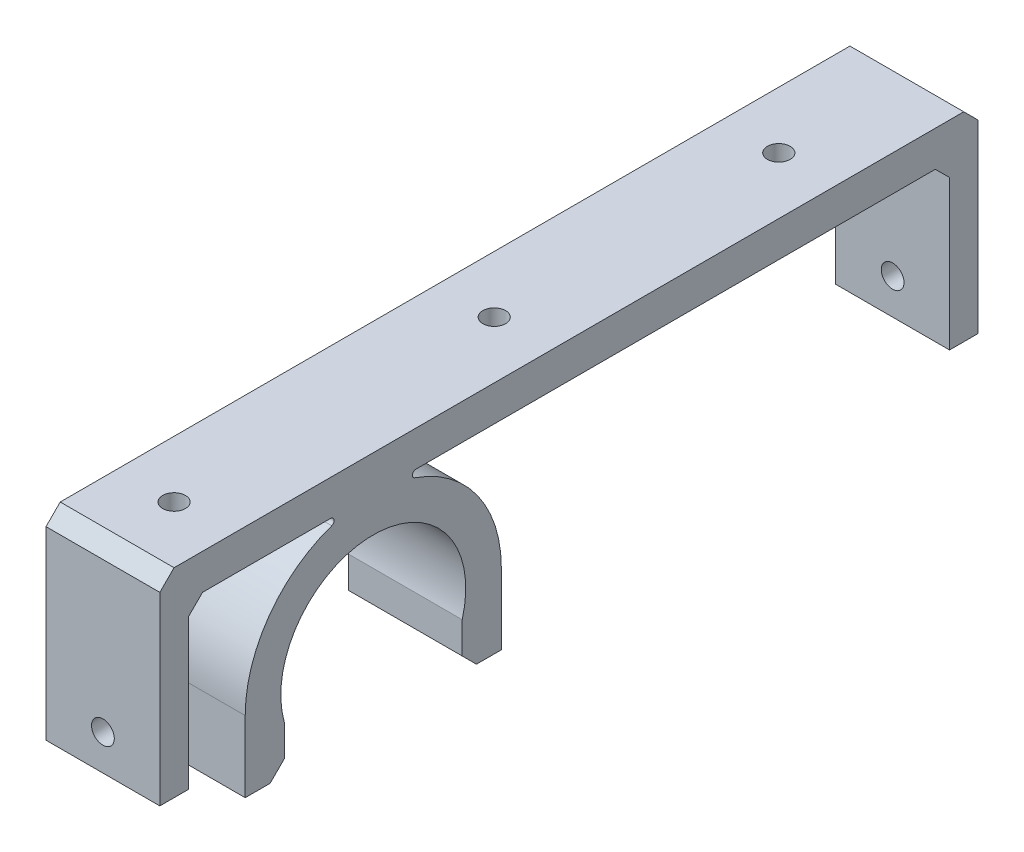
ISO-10303-21;
HEADER;
FILE_DESCRIPTION(('STEP AP214'),'2;1');
FILE_NAME('part.step','',(''),(''),'','','');
FILE_SCHEMA(('AUTOMOTIVE_DESIGN { 1 0 10303 214 1 1 1 1 }'));
ENDSEC;
DATA;
#1=APPLICATION_CONTEXT('core data for automotive mechanical design processes');
#2=APPLICATION_PROTOCOL_DEFINITION('international standard','automotive_design',2000,#1);
#3=PRODUCT_CONTEXT('',#1,'mechanical');
#4=PRODUCT('Part','Part','',(#3));
#5=PRODUCT_RELATED_PRODUCT_CATEGORY('part','',(#4));
#6=PRODUCT_DEFINITION_FORMATION('','',#4);
#7=PRODUCT_DEFINITION_CONTEXT('part definition',#1,'design');
#8=PRODUCT_DEFINITION('design','',#6,#7);
#9=PRODUCT_DEFINITION_SHAPE('','',#8);
#10=(LENGTH_UNIT() NAMED_UNIT(*) SI_UNIT(.MILLI.,.METRE.));
#11=(NAMED_UNIT(*) PLANE_ANGLE_UNIT() SI_UNIT($,.RADIAN.));
#12=(NAMED_UNIT(*) SI_UNIT($,.STERADIAN.) SOLID_ANGLE_UNIT());
#13=UNCERTAINTY_MEASURE_WITH_UNIT(LENGTH_MEASURE(1.E-05),#10,'distance_accuracy_value','');
#14=(GEOMETRIC_REPRESENTATION_CONTEXT(3) GLOBAL_UNCERTAINTY_ASSIGNED_CONTEXT((#13)) GLOBAL_UNIT_ASSIGNED_CONTEXT((#10,
#11,#12)) REPRESENTATION_CONTEXT('',''));
#15=CARTESIAN_POINT('',(0.,0.,0.));
#16=DIRECTION('',(0.,0.,1.));
#17=DIRECTION('',(1.,0.,0.));
#18=AXIS2_PLACEMENT_3D('',#15,#16,#17);
#19=CARTESIAN_POINT('',(8.,-10.,-12.5));
#20=DIRECTION('',(0.,1.,0.));
#21=DIRECTION('',(0.,0.,1.));
#22=AXIS2_PLACEMENT_3D('',#19,#20,#21);
#23=PLANE('',#22);
#24=DIRECTION('',(0.,0.,-1.));
#25=VECTOR('',#24,1.);
#26=CARTESIAN_POINT('',(8.,-10.,-12.5));
#27=LINE('',#26,#25);
#28=CARTESIAN_POINT('',(8.,-10.,-14.5));
#29=VERTEX_POINT('',#28);
#30=CARTESIAN_POINT('',(8.,-10.,-18.));
#31=VERTEX_POINT('',#30);
#32=EDGE_CURVE('E210',#29,#31,#27,.T.);
#33=ORIENTED_EDGE('',*,*,#32,.F.);
#34=DIRECTION('',(-1.,0.,0.));
#35=VECTOR('',#34,1.);
#36=CARTESIAN_POINT('',(8.,-10.,-14.5));
#37=LINE('',#36,#35);
#38=CARTESIAN_POINT('',(-8.,-10.,-14.5));
#39=VERTEX_POINT('',#38);
#40=EDGE_CURVE('E259',#29,#39,#37,.T.);
#41=ORIENTED_EDGE('',*,*,#40,.T.);
#42=DIRECTION('',(0.,0.,-1.));
#43=VECTOR('',#42,1.);
#44=CARTESIAN_POINT('',(-8.,-10.,-12.5));
#45=LINE('',#44,#43);
#46=CARTESIAN_POINT('',(-8.,-10.,-18.));
#47=VERTEX_POINT('',#46);
#48=EDGE_CURVE('E234',#39,#47,#45,.T.);
#49=ORIENTED_EDGE('',*,*,#48,.T.);
#50=DIRECTION('',(-1.,0.,0.));
#51=VECTOR('',#50,1.);
#52=CARTESIAN_POINT('',(8.,-10.,-18.));
#53=LINE('',#52,#51);
#54=EDGE_CURVE('E227',#31,#47,#53,.T.);
#55=ORIENTED_EDGE('',*,*,#54,.F.);
#56=EDGE_LOOP('',(#33,#41,#49,#55));
#57=FACE_BOUND('',#56,.T.);
#58=ADVANCED_FACE('F37',(#57),#23,.F.);
#59=CARTESIAN_POINT('',(8.,-10.,-18.));
#60=DIRECTION('',(0.,0.,1.));
#61=DIRECTION('',(0.,-1.,0.));
#62=AXIS2_PLACEMENT_3D('',#59,#60,#61);
#63=PLANE('',#62);
#64=DIRECTION('',(0.,1.,0.));
#65=VECTOR('',#64,1.);
#66=CARTESIAN_POINT('',(-8.,-10.,-18.));
#67=LINE('',#66,#65);
#68=CARTESIAN_POINT('',(-8.,0.,-18.));
#69=VERTEX_POINT('',#68);
#70=EDGE_CURVE('E392',#47,#69,#67,.T.);
#71=ORIENTED_EDGE('',*,*,#70,.T.);
#72=DIRECTION('',(-1.,0.,0.));
#73=VECTOR('',#72,1.);
#74=CARTESIAN_POINT('',(8.,0.,-18.));
#75=LINE('',#74,#73);
#76=CARTESIAN_POINT('',(8.,0.,-18.));
#77=VERTEX_POINT('',#76);
#78=EDGE_CURVE('E229',#77,#69,#75,.T.);
#79=ORIENTED_EDGE('',*,*,#78,.F.);
#80=DIRECTION('',(0.,1.,0.));
#81=VECTOR('',#80,1.);
#82=CARTESIAN_POINT('',(8.,-10.,-18.));
#83=LINE('',#82,#81);
#84=EDGE_CURVE('E214',#31,#77,#83,.T.);
#85=ORIENTED_EDGE('',*,*,#84,.F.);
#86=ORIENTED_EDGE('',*,*,#54,.T.);
#87=EDGE_LOOP('',(#71,#79,#85,#86));
#88=FACE_BOUND('',#87,.T.);
#89=ADVANCED_FACE('F226',(#88),#63,.F.);
#90=CARTESIAN_POINT('',(8.,0.,0.));
#91=DIRECTION('',(-1.,0.,0.));
#92=DIRECTION('',(0.,0.,1.));
#93=AXIS2_PLACEMENT_3D('',#90,#91,#92);
#94=CYLINDRICAL_SURFACE('',#93,18.);
#95=CARTESIAN_POINT('',(-8.,0.,0.));
#96=DIRECTION('',(1.,0.,0.));
#97=DIRECTION('',(0.,0.,-1.));
#98=AXIS2_PLACEMENT_3D('',#95,#96,#97);
#99=CIRCLE('',#98,18.);
#100=CARTESIAN_POINT('',(-8.,17.027027027027,-5.83783783783784));
#101=VERTEX_POINT('',#100);
#102=EDGE_CURVE('E386',#69,#101,#99,.T.);
#103=ORIENTED_EDGE('',*,*,#102,.T.);
#104=DIRECTION('',(-1.,0.,0.));
#105=VECTOR('',#104,1.);
#106=CARTESIAN_POINT('',(8.,17.027027027027,-5.83783783783784));
#107=LINE('',#106,#105);
#108=CARTESIAN_POINT('',(8.,17.027027027027,-5.83783783783784));
#109=VERTEX_POINT('',#108);
#110=EDGE_CURVE('E241',#109,#101,#107,.T.);
#111=ORIENTED_EDGE('',*,*,#110,.F.);
#112=CARTESIAN_POINT('',(8.,0.,0.));
#113=DIRECTION('',(1.,0.,0.));
#114=DIRECTION('',(0.,0.,-1.));
#115=AXIS2_PLACEMENT_3D('',#112,#113,#114);
#116=CIRCLE('',#115,18.);
#117=EDGE_CURVE('E231',#77,#109,#116,.T.);
#118=ORIENTED_EDGE('',*,*,#117,.F.);
#119=ORIENTED_EDGE('',*,*,#78,.T.);
#120=EDGE_LOOP('',(#103,#111,#118,#119));
#121=FACE_BOUND('',#120,.T.);
#122=ADVANCED_FACE('F446',(#121),#94,.T.);
#123=CARTESIAN_POINT('',(8.,17.5,-6.));
#124=DIRECTION('',(-1.,0.,0.));
#125=DIRECTION('',(0.,0.,1.));
#126=AXIS2_PLACEMENT_3D('',#123,#124,#125);
#127=CYLINDRICAL_SURFACE('',#126,0.5);
#128=CARTESIAN_POINT('',(-8.,17.5,-6.));
#129=DIRECTION('',(-1.,0.,0.));
#130=DIRECTION('',(0.,0.,-1.));
#131=AXIS2_PLACEMENT_3D('',#128,#129,#130);
#132=CIRCLE('',#131,0.5);
#133=CARTESIAN_POINT('',(-8.,18.,-6.));
#134=VERTEX_POINT('',#133);
#135=EDGE_CURVE('E381',#101,#134,#132,.T.);
#136=ORIENTED_EDGE('',*,*,#135,.T.);
#137=DIRECTION('',(-1.,0.,0.));
#138=VECTOR('',#137,1.);
#139=CARTESIAN_POINT('',(8.,18.,-6.));
#140=LINE('',#139,#138);
#141=CARTESIAN_POINT('',(8.,18.,-6.));
#142=VERTEX_POINT('',#141);
#143=EDGE_CURVE('E372',#142,#134,#140,.T.);
#144=ORIENTED_EDGE('',*,*,#143,.F.);
#145=CARTESIAN_POINT('',(8.,17.5,-6.));
#146=DIRECTION('',(-1.,0.,0.));
#147=DIRECTION('',(0.,0.,-1.));
#148=AXIS2_PLACEMENT_3D('',#145,#146,#147);
#149=CIRCLE('',#148,0.5);
#150=EDGE_CURVE('E382',#109,#142,#149,.T.);
#151=ORIENTED_EDGE('',*,*,#150,.F.);
#152=ORIENTED_EDGE('',*,*,#110,.T.);
#153=EDGE_LOOP('',(#136,#144,#151,#152));
#154=FACE_BOUND('',#153,.T.);
#155=ADVANCED_FACE('F379',(#154),#127,.F.);
#156=CARTESIAN_POINT('',(8.,18.,-81.));
#157=DIRECTION('',(0.,1.,0.));
#158=DIRECTION('',(0.,0.,1.));
#159=AXIS2_PLACEMENT_3D('',#156,#157,#158);
#160=PLANE('',#159);
#161=CARTESIAN_POINT('',(0.,18.,-25.));
#162=DIRECTION('',(0.,1.,0.));
#163=DIRECTION('',(0.,0.,1.));
#164=AXIS2_PLACEMENT_3D('',#161,#162,#163);
#165=CIRCLE('',#164,1.6);
#166=CARTESIAN_POINT('',(0.,18.,-23.4));
#167=VERTEX_POINT('',#166);
#168=EDGE_CURVE('E465',#167,#167,#165,.F.);
#169=ORIENTED_EDGE('',*,*,#168,.F.);
#170=EDGE_LOOP('',(#169));
#171=FACE_BOUND('',#170,.T.);
#172=CARTESIAN_POINT('',(0.,18.,-65.));
#173=DIRECTION('',(0.,1.,0.));
#174=DIRECTION('',(0.,0.,1.));
#175=AXIS2_PLACEMENT_3D('',#172,#173,#174);
#176=CIRCLE('',#175,1.6);
#177=CARTESIAN_POINT('',(0.,18.,-63.4));
#178=VERTEX_POINT('',#177);
#179=EDGE_CURVE('E459',#178,#178,#176,.F.);
#180=ORIENTED_EDGE('',*,*,#179,.F.);
#181=EDGE_LOOP('',(#180));
#182=FACE_BOUND('',#181,.T.);
#183=DIRECTION('',(0.,0.,-1.));
#184=VECTOR('',#183,1.);
#185=CARTESIAN_POINT('',(-8.,18.,-81.));
#186=LINE('',#185,#184);
#187=CARTESIAN_POINT('',(-8.,18.,-79.));
#188=VERTEX_POINT('',#187);
#189=EDGE_CURVE('E388',#134,#188,#186,.T.);
#190=ORIENTED_EDGE('',*,*,#189,.T.);
#191=DIRECTION('',(1.,0.,0.));
#192=VECTOR('',#191,1.);
#193=CARTESIAN_POINT('',(8.,18.,-79.));
#194=LINE('',#193,#192);
#195=CARTESIAN_POINT('',(8.,18.,-79.));
#196=VERTEX_POINT('',#195);
#197=EDGE_CURVE('E239',#188,#196,#194,.T.);
#198=ORIENTED_EDGE('',*,*,#197,.T.);
#199=DIRECTION('',(0.,0.,-1.));
#200=VECTOR('',#199,1.);
#201=CARTESIAN_POINT('',(8.,18.,-81.));
#202=LINE('',#201,#200);
#203=EDGE_CURVE('E415',#142,#196,#202,.T.);
#204=ORIENTED_EDGE('',*,*,#203,.F.);
#205=ORIENTED_EDGE('',*,*,#143,.T.);
#206=EDGE_LOOP('',(#190,#198,#204,#205));
#207=FACE_BOUND('',#206,.T.);
#208=ADVANCED_FACE('F414',(#171,#182,#207),#160,.F.);
#209=CARTESIAN_POINT('',(8.,-5.00000000000001,-81.));
#210=DIRECTION('',(0.,0.,-1.));
#211=DIRECTION('',(-1.,0.,0.));
#212=AXIS2_PLACEMENT_3D('',#209,#210,#211);
#213=PLANE('',#212);
#214=CARTESIAN_POINT('',(0.,2.24820162486595E-13,-81.));
#215=DIRECTION('',(0.,0.,-1.));
#216=DIRECTION('',(-1.,0.,0.));
#217=AXIS2_PLACEMENT_3D('',#214,#215,#216);
#218=CIRCLE('',#217,1.59999999999993);
#219=CARTESIAN_POINT('',(-1.59999999999993,2.24820162486595E-13,-81.));
#220=VERTEX_POINT('',#219);
#221=EDGE_CURVE('E453',#220,#220,#218,.F.);
#222=ORIENTED_EDGE('',*,*,#221,.F.);
#223=EDGE_LOOP('',(#222));
#224=FACE_BOUND('',#223,.T.);
#225=DIRECTION('',(0.,-1.,0.));
#226=VECTOR('',#225,1.);
#227=CARTESIAN_POINT('',(8.,-5.00000000000001,-81.));
#228=LINE('',#227,#226);
#229=CARTESIAN_POINT('',(8.,16.,-81.));
#230=VERTEX_POINT('',#229);
#231=CARTESIAN_POINT('',(8.,-5.00000000000001,-81.));
#232=VERTEX_POINT('',#231);
#233=EDGE_CURVE('E406',#230,#232,#228,.T.);
#234=ORIENTED_EDGE('',*,*,#233,.F.);
#235=DIRECTION('',(-1.,0.,0.));
#236=VECTOR('',#235,1.);
#237=CARTESIAN_POINT('',(-8.,16.,-81.));
#238=LINE('',#237,#236);
#239=CARTESIAN_POINT('',(-8.,16.,-81.));
#240=VERTEX_POINT('',#239);
#241=EDGE_CURVE('E236',#230,#240,#238,.T.);
#242=ORIENTED_EDGE('',*,*,#241,.T.);
#243=DIRECTION('',(0.,-1.,0.));
#244=VECTOR('',#243,1.);
#245=CARTESIAN_POINT('',(-8.,-5.00000000000001,-81.));
#246=LINE('',#245,#244);
#247=CARTESIAN_POINT('',(-8.,-5.00000000000001,-81.));
#248=VERTEX_POINT('',#247);
#249=EDGE_CURVE('E390',#240,#248,#246,.T.);
#250=ORIENTED_EDGE('',*,*,#249,.T.);
#251=DIRECTION('',(-1.,0.,0.));
#252=VECTOR('',#251,1.);
#253=CARTESIAN_POINT('',(8.,-5.00000000000001,-81.));
#254=LINE('',#253,#252);
#255=EDGE_CURVE('E369',#232,#248,#254,.T.);
#256=ORIENTED_EDGE('',*,*,#255,.F.);
#257=EDGE_LOOP('',(#234,#242,#250,#256));
#258=FACE_BOUND('',#257,.T.);
#259=ADVANCED_FACE('F404',(#224,#258),#213,.F.);
#260=CARTESIAN_POINT('',(8.,-5.00000000000001,-85.));
#261=DIRECTION('',(0.,1.,0.));
#262=DIRECTION('',(0.,0.,1.));
#263=AXIS2_PLACEMENT_3D('',#260,#261,#262);
#264=PLANE('',#263);
#265=DIRECTION('',(0.,0.,-1.));
#266=VECTOR('',#265,1.);
#267=CARTESIAN_POINT('',(-8.,-5.00000000000001,-85.));
#268=LINE('',#267,#266);
#269=CARTESIAN_POINT('',(-8.,-5.00000000000001,-85.));
#270=VERTEX_POINT('',#269);
#271=EDGE_CURVE('E318',#248,#270,#268,.T.);
#272=ORIENTED_EDGE('',*,*,#271,.T.);
#273=DIRECTION('',(-1.,0.,0.));
#274=VECTOR('',#273,1.);
#275=CARTESIAN_POINT('',(8.,-5.00000000000001,-85.));
#276=LINE('',#275,#274);
#277=CARTESIAN_POINT('',(8.,-5.00000000000001,-85.));
#278=VERTEX_POINT('',#277);
#279=EDGE_CURVE('E367',#278,#270,#276,.T.);
#280=ORIENTED_EDGE('',*,*,#279,.F.);
#281=DIRECTION('',(0.,0.,-1.));
#282=VECTOR('',#281,1.);
#283=CARTESIAN_POINT('',(8.,-5.00000000000001,-85.));
#284=LINE('',#283,#282);
#285=EDGE_CURVE('E299',#232,#278,#284,.T.);
#286=ORIENTED_EDGE('',*,*,#285,.F.);
#287=ORIENTED_EDGE('',*,*,#255,.T.);
#288=EDGE_LOOP('',(#272,#280,#286,#287));
#289=FACE_BOUND('',#288,.T.);
#290=ADVANCED_FACE('F399',(#289),#264,.F.);
#291=CARTESIAN_POINT('',(8.,23.,-85.));
#292=DIRECTION('',(0.,0.,1.));
#293=DIRECTION('',(1.,0.,0.));
#294=AXIS2_PLACEMENT_3D('',#291,#292,#293);
#295=PLANE('',#294);
#296=CARTESIAN_POINT('',(0.,2.35922392732846E-13,-85.));
#297=DIRECTION('',(0.,0.,-1.));
#298=DIRECTION('',(0.,1.,0.));
#299=AXIS2_PLACEMENT_3D('',#296,#297,#298);
#300=CIRCLE('',#299,1.59999999999993);
#301=CARTESIAN_POINT('',(0.,1.60000000000017,-85.));
#302=VERTEX_POINT('',#301);
#303=EDGE_CURVE('E456',#302,#302,#300,.T.);
#304=ORIENTED_EDGE('',*,*,#303,.F.);
#305=EDGE_LOOP('',(#304));
#306=FACE_BOUND('',#305,.T.);
#307=DIRECTION('',(0.,1.,0.));
#308=VECTOR('',#307,1.);
#309=CARTESIAN_POINT('',(-8.,23.,-85.));
#310=LINE('',#309,#308);
#311=CARTESIAN_POINT('',(-8.,21.,-85.));
#312=VERTEX_POINT('',#311);
#313=EDGE_CURVE('E293',#270,#312,#310,.T.);
#314=ORIENTED_EDGE('',*,*,#313,.T.);
#315=DIRECTION('',(1.,0.,0.));
#316=VECTOR('',#315,1.);
#317=CARTESIAN_POINT('',(8.,21.,-85.));
#318=LINE('',#317,#316);
#319=CARTESIAN_POINT('',(8.,21.,-85.));
#320=VERTEX_POINT('',#319);
#321=EDGE_CURVE('E45',#312,#320,#318,.T.);
#322=ORIENTED_EDGE('',*,*,#321,.T.);
#323=DIRECTION('',(0.,1.,0.));
#324=VECTOR('',#323,1.);
#325=CARTESIAN_POINT('',(8.,18.,-85.));
#326=LINE('',#325,#324);
#327=EDGE_CURVE('E292',#278,#320,#326,.T.);
#328=ORIENTED_EDGE('',*,*,#327,.F.);
#329=ORIENTED_EDGE('',*,*,#279,.T.);
#330=EDGE_LOOP('',(#314,#322,#328,#329));
#331=FACE_BOUND('',#330,.T.);
#332=ADVANCED_FACE('F290',(#306,#331),#295,.F.);
#333=CARTESIAN_POINT('',(8.,23.,30.));
#334=DIRECTION('',(0.,-1.,0.));
#335=DIRECTION('',(0.,0.,-1.));
#336=AXIS2_PLACEMENT_3D('',#333,#334,#335);
#337=PLANE('',#336);
#338=CARTESIAN_POINT('',(0.,23.,-25.));
#339=DIRECTION('',(0.,1.,0.));
#340=DIRECTION('',(0.,0.,1.));
#341=AXIS2_PLACEMENT_3D('',#338,#339,#340);
#342=CIRCLE('',#341,1.6);
#343=CARTESIAN_POINT('',(0.,23.,-23.4));
#344=VERTEX_POINT('',#343);
#345=EDGE_CURVE('E469',#344,#344,#342,.T.);
#346=ORIENTED_EDGE('',*,*,#345,.F.);
#347=EDGE_LOOP('',(#346));
#348=FACE_BOUND('',#347,.T.);
#349=CARTESIAN_POINT('',(0.,23.,20.));
#350=DIRECTION('',(0.,1.,0.));
#351=DIRECTION('',(0.,0.,1.));
#352=AXIS2_PLACEMENT_3D('',#349,#350,#351);
#353=CIRCLE('',#352,1.6);
#354=CARTESIAN_POINT('',(0.,23.,21.6));
#355=VERTEX_POINT('',#354);
#356=EDGE_CURVE('E470',#355,#355,#353,.T.);
#357=ORIENTED_EDGE('',*,*,#356,.F.);
#358=EDGE_LOOP('',(#357));
#359=FACE_BOUND('',#358,.T.);
#360=CARTESIAN_POINT('',(0.,23.,-65.));
#361=DIRECTION('',(0.,1.,0.));
#362=DIRECTION('',(0.,0.,1.));
#363=AXIS2_PLACEMENT_3D('',#360,#361,#362);
#364=CIRCLE('',#363,1.6);
#365=CARTESIAN_POINT('',(0.,23.,-63.4));
#366=VERTEX_POINT('',#365);
#367=EDGE_CURVE('E462',#366,#366,#364,.T.);
#368=ORIENTED_EDGE('',*,*,#367,.F.);
#369=EDGE_LOOP('',(#368));
#370=FACE_BOUND('',#369,.T.);
#371=DIRECTION('',(0.,0.,1.));
#372=VECTOR('',#371,1.);
#373=CARTESIAN_POINT('',(8.,23.,30.));
#374=LINE('',#373,#372);
#375=CARTESIAN_POINT('',(8.,23.,-83.));
#376=VERTEX_POINT('',#375);
#377=CARTESIAN_POINT('',(8.,23.,28.));
#378=VERTEX_POINT('',#377);
#379=EDGE_CURVE('E301',#376,#378,#374,.T.);
#380=ORIENTED_EDGE('',*,*,#379,.F.);
#381=DIRECTION('',(-1.,0.,0.));
#382=VECTOR('',#381,1.);
#383=CARTESIAN_POINT('',(8.,23.,-83.));
#384=LINE('',#383,#382);
#385=CARTESIAN_POINT('',(-8.,23.,-83.));
#386=VERTEX_POINT('',#385);
#387=EDGE_CURVE('E283',#376,#386,#384,.T.);
#388=ORIENTED_EDGE('',*,*,#387,.T.);
#389=DIRECTION('',(0.,0.,1.));
#390=VECTOR('',#389,1.);
#391=CARTESIAN_POINT('',(-8.,23.,30.));
#392=LINE('',#391,#390);
#393=CARTESIAN_POINT('',(-8.,23.,28.));
#394=VERTEX_POINT('',#393);
#395=EDGE_CURVE('E309',#386,#394,#392,.T.);
#396=ORIENTED_EDGE('',*,*,#395,.T.);
#397=DIRECTION('',(1.,0.,0.));
#398=VECTOR('',#397,1.);
#399=CARTESIAN_POINT('',(8.,23.,28.));
#400=LINE('',#399,#398);
#401=EDGE_CURVE('E281',#394,#378,#400,.T.);
#402=ORIENTED_EDGE('',*,*,#401,.T.);
#403=EDGE_LOOP('',(#380,#388,#396,#402));
#404=FACE_BOUND('',#403,.T.);
#405=ADVANCED_FACE('F308',(#348,#359,#370,#404),#337,.F.);
#406=CARTESIAN_POINT('',(8.,18.,30.));
#407=DIRECTION('',(0.,0.,-1.));
#408=DIRECTION('',(0.,1.,0.));
#409=AXIS2_PLACEMENT_3D('',#406,#407,#408);
#410=PLANE('',#409);
#411=CARTESIAN_POINT('',(0.,0.,30.));
#412=DIRECTION('',(0.,0.,1.));
#413=DIRECTION('',(1.,0.,0.));
#414=AXIS2_PLACEMENT_3D('',#411,#412,#413);
#415=CIRCLE('',#414,1.6);
#416=CARTESIAN_POINT('',(1.6,0.,30.));
#417=VERTEX_POINT('',#416);
#418=EDGE_CURVE('E445',#417,#417,#415,.T.);
#419=ORIENTED_EDGE('',*,*,#418,.F.);
#420=EDGE_LOOP('',(#419));
#421=FACE_BOUND('',#420,.T.);
#422=DIRECTION('',(0.,-1.,0.));
#423=VECTOR('',#422,1.);
#424=CARTESIAN_POINT('',(8.,18.,30.));
#425=LINE('',#424,#423);
#426=CARTESIAN_POINT('',(8.,21.,30.));
#427=VERTEX_POINT('',#426);
#428=CARTESIAN_POINT('',(8.,-5.00000000000002,30.));
#429=VERTEX_POINT('',#428);
#430=EDGE_CURVE('E423',#427,#429,#425,.T.);
#431=ORIENTED_EDGE('',*,*,#430,.F.);
#432=DIRECTION('',(-1.,0.,0.));
#433=VECTOR('',#432,1.);
#434=CARTESIAN_POINT('',(8.,21.,30.));
#435=LINE('',#434,#433);
#436=CARTESIAN_POINT('',(-8.,21.,30.));
#437=VERTEX_POINT('',#436);
#438=EDGE_CURVE('E11',#427,#437,#435,.T.);
#439=ORIENTED_EDGE('',*,*,#438,.T.);
#440=DIRECTION('',(0.,-1.,0.));
#441=VECTOR('',#440,1.);
#442=CARTESIAN_POINT('',(-8.,18.,30.));
#443=LINE('',#442,#441);
#444=CARTESIAN_POINT('',(-8.,-5.00000000000002,30.));
#445=VERTEX_POINT('',#444);
#446=EDGE_CURVE('E314',#437,#445,#443,.T.);
#447=ORIENTED_EDGE('',*,*,#446,.T.);
#448=DIRECTION('',(-1.,0.,0.));
#449=VECTOR('',#448,1.);
#450=CARTESIAN_POINT('',(8.,-5.00000000000002,30.));
#451=LINE('',#450,#449);
#452=EDGE_CURVE('E364',#429,#445,#451,.T.);
#453=ORIENTED_EDGE('',*,*,#452,.F.);
#454=EDGE_LOOP('',(#431,#439,#447,#453));
#455=FACE_BOUND('',#454,.T.);
#456=ADVANCED_FACE('F483',(#421,#455),#410,.F.);
#457=CARTESIAN_POINT('',(8.,-5.00000000000002,30.));
#458=DIRECTION('',(0.,1.,0.));
#459=DIRECTION('',(0.,0.,1.));
#460=AXIS2_PLACEMENT_3D('',#457,#458,#459);
#461=PLANE('',#460);
#462=DIRECTION('',(0.,0.,-1.));
#463=VECTOR('',#462,1.);
#464=CARTESIAN_POINT('',(-8.,-5.00000000000002,30.));
#465=LINE('',#464,#463);
#466=CARTESIAN_POINT('',(-8.,-5.00000000000002,26.));
#467=VERTEX_POINT('',#466);
#468=EDGE_CURVE('E316',#445,#467,#465,.T.);
#469=ORIENTED_EDGE('',*,*,#468,.T.);
#470=DIRECTION('',(-1.,0.,0.));
#471=VECTOR('',#470,1.);
#472=CARTESIAN_POINT('',(8.,-5.00000000000002,26.));
#473=LINE('',#472,#471);
#474=CARTESIAN_POINT('',(8.,-5.00000000000002,26.));
#475=VERTEX_POINT('',#474);
#476=EDGE_CURVE('E361',#475,#467,#473,.T.);
#477=ORIENTED_EDGE('',*,*,#476,.F.);
#478=DIRECTION('',(0.,0.,-1.));
#479=VECTOR('',#478,1.);
#480=CARTESIAN_POINT('',(8.,-5.00000000000002,30.));
#481=LINE('',#480,#479);
#482=EDGE_CURVE('E425',#429,#475,#481,.T.);
#483=ORIENTED_EDGE('',*,*,#482,.F.);
#484=ORIENTED_EDGE('',*,*,#452,.T.);
#485=EDGE_LOOP('',(#469,#477,#483,#484));
#486=FACE_BOUND('',#485,.T.);
#487=ADVANCED_FACE('F549',(#486),#461,.F.);
#488=CARTESIAN_POINT('',(8.,-5.00000000000002,26.));
#489=DIRECTION('',(0.,0.,1.));
#490=DIRECTION('',(1.,0.,0.));
#491=AXIS2_PLACEMENT_3D('',#488,#489,#490);
#492=PLANE('',#491);
#493=CARTESIAN_POINT('',(0.,0.,26.));
#494=DIRECTION('',(0.,0.,1.));
#495=DIRECTION('',(1.,0.,0.));
#496=AXIS2_PLACEMENT_3D('',#493,#494,#495);
#497=CIRCLE('',#496,1.6);
#498=CARTESIAN_POINT('',(1.6,0.,26.));
#499=VERTEX_POINT('',#498);
#500=EDGE_CURVE('E450',#499,#499,#497,.F.);
#501=ORIENTED_EDGE('',*,*,#500,.F.);
#502=EDGE_LOOP('',(#501));
#503=FACE_BOUND('',#502,.T.);
#504=DIRECTION('',(0.,1.,0.));
#505=VECTOR('',#504,1.);
#506=CARTESIAN_POINT('',(-8.,-5.00000000000002,26.));
#507=LINE('',#506,#505);
#508=CARTESIAN_POINT('',(-8.,16.,26.));
#509=VERTEX_POINT('',#508);
#510=EDGE_CURVE('E323',#467,#509,#507,.T.);
#511=ORIENTED_EDGE('',*,*,#510,.T.);
#512=DIRECTION('',(1.,0.,0.));
#513=VECTOR('',#512,1.);
#514=CARTESIAN_POINT('',(8.,16.,26.));
#515=LINE('',#514,#513);
#516=CARTESIAN_POINT('',(8.,16.,26.));
#517=VERTEX_POINT('',#516);
#518=EDGE_CURVE('E249',#509,#517,#515,.T.);
#519=ORIENTED_EDGE('',*,*,#518,.T.);
#520=DIRECTION('',(0.,1.,0.));
#521=VECTOR('',#520,1.);
#522=CARTESIAN_POINT('',(8.,-5.00000000000002,26.));
#523=LINE('',#522,#521);
#524=EDGE_CURVE('E427',#475,#517,#523,.T.);
#525=ORIENTED_EDGE('',*,*,#524,.F.);
#526=ORIENTED_EDGE('',*,*,#476,.T.);
#527=EDGE_LOOP('',(#511,#519,#525,#526));
#528=FACE_BOUND('',#527,.T.);
#529=ADVANCED_FACE('F597',(#503,#528),#492,.F.);
#530=CARTESIAN_POINT('',(8.,18.,6.));
#531=DIRECTION('',(0.,1.,0.));
#532=DIRECTION('',(0.,0.,1.));
#533=AXIS2_PLACEMENT_3D('',#530,#531,#532);
#534=PLANE('',#533);
#535=CARTESIAN_POINT('',(0.,18.,20.));
#536=DIRECTION('',(0.,1.,0.));
#537=DIRECTION('',(0.,0.,1.));
#538=AXIS2_PLACEMENT_3D('',#535,#536,#537);
#539=CIRCLE('',#538,1.6);
#540=CARTESIAN_POINT('',(0.,18.,21.6));
#541=VERTEX_POINT('',#540);
#542=EDGE_CURVE('E466',#541,#541,#539,.F.);
#543=ORIENTED_EDGE('',*,*,#542,.F.);
#544=EDGE_LOOP('',(#543));
#545=FACE_BOUND('',#544,.T.);
#546=DIRECTION('',(0.,0.,-1.));
#547=VECTOR('',#546,1.);
#548=CARTESIAN_POINT('',(8.,18.,6.));
#549=LINE('',#548,#547);
#550=CARTESIAN_POINT('',(8.,18.,24.));
#551=VERTEX_POINT('',#550);
#552=CARTESIAN_POINT('',(8.,18.,6.));
#553=VERTEX_POINT('',#552);
#554=EDGE_CURVE('E430',#551,#553,#549,.T.);
#555=ORIENTED_EDGE('',*,*,#554,.F.);
#556=DIRECTION('',(-1.,0.,0.));
#557=VECTOR('',#556,1.);
#558=CARTESIAN_POINT('',(-8.,18.,24.));
#559=LINE('',#558,#557);
#560=CARTESIAN_POINT('',(-8.,18.,24.));
#561=VERTEX_POINT('',#560);
#562=EDGE_CURVE('E246',#551,#561,#559,.T.);
#563=ORIENTED_EDGE('',*,*,#562,.T.);
#564=DIRECTION('',(0.,0.,-1.));
#565=VECTOR('',#564,1.);
#566=CARTESIAN_POINT('',(-8.,18.,6.));
#567=LINE('',#566,#565);
#568=CARTESIAN_POINT('',(-8.,18.,6.));
#569=VERTEX_POINT('',#568);
#570=EDGE_CURVE('E326',#561,#569,#567,.T.);
#571=ORIENTED_EDGE('',*,*,#570,.T.);
#572=DIRECTION('',(-1.,0.,0.));
#573=VECTOR('',#572,1.);
#574=CARTESIAN_POINT('',(8.,18.,6.));
#575=LINE('',#574,#573);
#576=EDGE_CURVE('E358',#553,#569,#575,.T.);
#577=ORIENTED_EDGE('',*,*,#576,.F.);
#578=EDGE_LOOP('',(#555,#563,#571,#577));
#579=FACE_BOUND('',#578,.T.);
#580=ADVANCED_FACE('F558',(#545,#579),#534,.F.);
#581=CARTESIAN_POINT('',(8.,17.5,6.));
#582=DIRECTION('',(-1.,0.,0.));
#583=DIRECTION('',(0.,0.,1.));
#584=AXIS2_PLACEMENT_3D('',#581,#582,#583);
#585=CYLINDRICAL_SURFACE('',#584,0.5);
#586=CARTESIAN_POINT('',(-8.,17.5,6.));
#587=DIRECTION('',(-1.,0.,0.));
#588=DIRECTION('',(0.,0.,-1.));
#589=AXIS2_PLACEMENT_3D('',#586,#587,#588);
#590=CIRCLE('',#589,0.5);
#591=CARTESIAN_POINT('',(-8.,17.027027027027,5.83783783783784));
#592=VERTEX_POINT('',#591);
#593=EDGE_CURVE('E328',#569,#592,#590,.T.);
#594=ORIENTED_EDGE('',*,*,#593,.T.);
#595=DIRECTION('',(-1.,0.,0.));
#596=VECTOR('',#595,1.);
#597=CARTESIAN_POINT('',(8.,17.027027027027,5.83783783783784));
#598=LINE('',#597,#596);
#599=CARTESIAN_POINT('',(8.,17.027027027027,5.83783783783784));
#600=VERTEX_POINT('',#599);
#601=EDGE_CURVE('E355',#600,#592,#598,.T.);
#602=ORIENTED_EDGE('',*,*,#601,.F.);
#603=CARTESIAN_POINT('',(8.,17.5,6.));
#604=DIRECTION('',(-1.,0.,0.));
#605=DIRECTION('',(0.,0.,-1.));
#606=AXIS2_PLACEMENT_3D('',#603,#604,#605);
#607=CIRCLE('',#606,0.5);
#608=EDGE_CURVE('E432',#553,#600,#607,.T.);
#609=ORIENTED_EDGE('',*,*,#608,.F.);
#610=ORIENTED_EDGE('',*,*,#576,.T.);
#611=EDGE_LOOP('',(#594,#602,#609,#610));
#612=FACE_BOUND('',#611,.T.);
#613=ADVANCED_FACE('F566',(#612),#585,.F.);
#614=CARTESIAN_POINT('',(8.,0.,0.));
#615=DIRECTION('',(-1.,0.,0.));
#616=DIRECTION('',(0.,0.,1.));
#617=AXIS2_PLACEMENT_3D('',#614,#615,#616);
#618=CYLINDRICAL_SURFACE('',#617,18.);
#619=CARTESIAN_POINT('',(-8.,0.,0.));
#620=DIRECTION('',(1.,0.,0.));
#621=DIRECTION('',(0.,0.,-1.));
#622=AXIS2_PLACEMENT_3D('',#619,#620,#621);
#623=CIRCLE('',#622,18.);
#624=CARTESIAN_POINT('',(-8.,0.,18.));
#625=VERTEX_POINT('',#624);
#626=EDGE_CURVE('E330',#592,#625,#623,.T.);
#627=ORIENTED_EDGE('',*,*,#626,.T.);
#628=DIRECTION('',(-1.,0.,0.));
#629=VECTOR('',#628,1.);
#630=CARTESIAN_POINT('',(8.,0.,18.));
#631=LINE('',#630,#629);
#632=CARTESIAN_POINT('',(8.,0.,18.));
#633=VERTEX_POINT('',#632);
#634=EDGE_CURVE('E352',#633,#625,#631,.T.);
#635=ORIENTED_EDGE('',*,*,#634,.F.);
#636=CARTESIAN_POINT('',(8.,0.,0.));
#637=DIRECTION('',(1.,0.,0.));
#638=DIRECTION('',(0.,0.,-1.));
#639=AXIS2_PLACEMENT_3D('',#636,#637,#638);
#640=CIRCLE('',#639,18.);
#641=EDGE_CURVE('E434',#600,#633,#640,.T.);
#642=ORIENTED_EDGE('',*,*,#641,.F.);
#643=ORIENTED_EDGE('',*,*,#601,.T.);
#644=EDGE_LOOP('',(#627,#635,#642,#643));
#645=FACE_BOUND('',#644,.T.);
#646=ADVANCED_FACE('F570',(#645),#618,.T.);
#647=CARTESIAN_POINT('',(8.,0.,18.));
#648=DIRECTION('',(0.,0.,-1.));
#649=DIRECTION('',(0.,1.,0.));
#650=AXIS2_PLACEMENT_3D('',#647,#648,#649);
#651=PLANE('',#650);
#652=DIRECTION('',(0.,-1.,0.));
#653=VECTOR('',#652,1.);
#654=CARTESIAN_POINT('',(-8.,0.,18.));
#655=LINE('',#654,#653);
#656=CARTESIAN_POINT('',(-8.,-10.,18.));
#657=VERTEX_POINT('',#656);
#658=EDGE_CURVE('E332',#625,#657,#655,.T.);
#659=ORIENTED_EDGE('',*,*,#658,.T.);
#660=DIRECTION('',(-1.,0.,0.));
#661=VECTOR('',#660,1.);
#662=CARTESIAN_POINT('',(8.,-10.,18.));
#663=LINE('',#662,#661);
#664=CARTESIAN_POINT('',(8.,-10.,18.));
#665=VERTEX_POINT('',#664);
#666=EDGE_CURVE('E349',#665,#657,#663,.T.);
#667=ORIENTED_EDGE('',*,*,#666,.F.);
#668=DIRECTION('',(0.,-1.,0.));
#669=VECTOR('',#668,1.);
#670=CARTESIAN_POINT('',(8.,0.,18.));
#671=LINE('',#670,#669);
#672=EDGE_CURVE('E436',#633,#665,#671,.T.);
#673=ORIENTED_EDGE('',*,*,#672,.F.);
#674=ORIENTED_EDGE('',*,*,#634,.T.);
#675=EDGE_LOOP('',(#659,#667,#673,#674));
#676=FACE_BOUND('',#675,.T.);
#677=ADVANCED_FACE('F575',(#676),#651,.F.);
#678=CARTESIAN_POINT('',(8.,-10.,18.));
#679=DIRECTION('',(0.,1.,0.));
#680=DIRECTION('',(0.,0.,1.));
#681=AXIS2_PLACEMENT_3D('',#678,#679,#680);
#682=PLANE('',#681);
#683=DIRECTION('',(0.,0.,-1.));
#684=VECTOR('',#683,1.);
#685=CARTESIAN_POINT('',(-8.,-10.,18.));
#686=LINE('',#685,#684);
#687=CARTESIAN_POINT('',(-8.,-10.,14.5));
#688=VERTEX_POINT('',#687);
#689=EDGE_CURVE('E334',#657,#688,#686,.T.);
#690=ORIENTED_EDGE('',*,*,#689,.T.);
#691=DIRECTION('',(1.,0.,0.));
#692=VECTOR('',#691,1.);
#693=CARTESIAN_POINT('',(8.,-10.,14.5));
#694=LINE('',#693,#692);
#695=CARTESIAN_POINT('',(8.,-10.,14.5));
#696=VERTEX_POINT('',#695);
#697=EDGE_CURVE('E60',#688,#696,#694,.T.);
#698=ORIENTED_EDGE('',*,*,#697,.T.);
#699=DIRECTION('',(0.,0.,-1.));
#700=VECTOR('',#699,1.);
#701=CARTESIAN_POINT('',(8.,-10.,18.));
#702=LINE('',#701,#700);
#703=EDGE_CURVE('E438',#665,#696,#702,.T.);
#704=ORIENTED_EDGE('',*,*,#703,.F.);
#705=ORIENTED_EDGE('',*,*,#666,.T.);
#706=EDGE_LOOP('',(#690,#698,#704,#705));
#707=FACE_BOUND('',#706,.T.);
#708=ADVANCED_FACE('F577',(#707),#682,.F.);
#709=CARTESIAN_POINT('',(8.,-3.57071421427143,12.5));
#710=DIRECTION('',(0.,0.,1.));
#711=DIRECTION('',(0.,-1.,0.));
#712=AXIS2_PLACEMENT_3D('',#709,#710,#711);
#713=PLANE('',#712);
#714=DIRECTION('',(0.,1.,0.));
#715=VECTOR('',#714,1.);
#716=CARTESIAN_POINT('',(8.,-3.57071421427143,12.5));
#717=LINE('',#716,#715);
#718=CARTESIAN_POINT('',(8.,-8.00000000000001,12.5));
#719=VERTEX_POINT('',#718);
#720=CARTESIAN_POINT('',(8.,-3.57071421427142,12.5));
#721=VERTEX_POINT('',#720);
#722=EDGE_CURVE('E440',#719,#721,#717,.T.);
#723=ORIENTED_EDGE('',*,*,#722,.F.);
#724=DIRECTION('',(-1.,0.,0.));
#725=VECTOR('',#724,1.);
#726=CARTESIAN_POINT('',(8.,-8.00000000000001,12.5));
#727=LINE('',#726,#725);
#728=CARTESIAN_POINT('',(-8.,-8.00000000000001,12.5));
#729=VERTEX_POINT('',#728);
#730=EDGE_CURVE('E277',#719,#729,#727,.T.);
#731=ORIENTED_EDGE('',*,*,#730,.T.);
#732=DIRECTION('',(0.,1.,0.));
#733=VECTOR('',#732,1.);
#734=CARTESIAN_POINT('',(-8.,-3.57071421427143,12.5));
#735=LINE('',#734,#733);
#736=CARTESIAN_POINT('',(-8.,-3.57071421427142,12.5));
#737=VERTEX_POINT('',#736);
#738=EDGE_CURVE('E336',#729,#737,#735,.T.);
#739=ORIENTED_EDGE('',*,*,#738,.T.);
#740=DIRECTION('',(-1.,0.,0.));
#741=VECTOR('',#740,1.);
#742=CARTESIAN_POINT('',(8.,-3.57071421427142,12.5));
#743=LINE('',#742,#741);
#744=EDGE_CURVE('E345',#721,#737,#743,.T.);
#745=ORIENTED_EDGE('',*,*,#744,.F.);
#746=EDGE_LOOP('',(#723,#731,#739,#745));
#747=FACE_BOUND('',#746,.T.);
#748=ADVANCED_FACE('F579',(#747),#713,.F.);
#749=CARTESIAN_POINT('',(8.,0.,0.));
#750=DIRECTION('',(-1.,0.,0.));
#751=DIRECTION('',(0.,0.,1.));
#752=AXIS2_PLACEMENT_3D('',#749,#750,#751);
#753=CYLINDRICAL_SURFACE('',#752,13.);
#754=CARTESIAN_POINT('',(-8.,0.,0.));
#755=DIRECTION('',(-1.,0.,0.));
#756=DIRECTION('',(0.,0.,-1.));
#757=AXIS2_PLACEMENT_3D('',#754,#755,#756);
#758=CIRCLE('',#757,13.);
#759=CARTESIAN_POINT('',(-8.,-3.57071421427142,-12.5));
#760=VERTEX_POINT('',#759);
#761=EDGE_CURVE('E338',#737,#760,#758,.T.);
#762=ORIENTED_EDGE('',*,*,#761,.T.);
#763=DIRECTION('',(-1.,0.,0.));
#764=VECTOR('',#763,1.);
#765=CARTESIAN_POINT('',(8.,-3.57071421427142,-12.5));
#766=LINE('',#765,#764);
#767=CARTESIAN_POINT('',(8.,-3.57071421427142,-12.5));
#768=VERTEX_POINT('',#767);
#769=EDGE_CURVE('E342',#768,#760,#766,.T.);
#770=ORIENTED_EDGE('',*,*,#769,.F.);
#771=CARTESIAN_POINT('',(8.,0.,0.));
#772=DIRECTION('',(-1.,0.,0.));
#773=DIRECTION('',(0.,0.,-1.));
#774=AXIS2_PLACEMENT_3D('',#771,#772,#773);
#775=CIRCLE('',#774,13.);
#776=EDGE_CURVE('E442',#721,#768,#775,.T.);
#777=ORIENTED_EDGE('',*,*,#776,.F.);
#778=ORIENTED_EDGE('',*,*,#744,.T.);
#779=EDGE_LOOP('',(#762,#770,#777,#778));
#780=FACE_BOUND('',#779,.T.);
#781=ADVANCED_FACE('F585',(#780),#753,.F.);
#782=CARTESIAN_POINT('',(8.,-3.57071421427142,-12.5));
#783=DIRECTION('',(0.,0.,-1.));
#784=DIRECTION('',(-1.,0.,0.));
#785=AXIS2_PLACEMENT_3D('',#782,#783,#784);
#786=PLANE('',#785);
#787=DIRECTION('',(0.,-1.,0.));
#788=VECTOR('',#787,1.);
#789=CARTESIAN_POINT('',(-8.,-3.57071421427142,-12.5));
#790=LINE('',#789,#788);
#791=CARTESIAN_POINT('',(-8.,-8.,-12.5));
#792=VERTEX_POINT('',#791);
#793=EDGE_CURVE('E222',#760,#792,#790,.T.);
#794=ORIENTED_EDGE('',*,*,#793,.T.);
#795=DIRECTION('',(1.,0.,0.));
#796=VECTOR('',#795,1.);
#797=CARTESIAN_POINT('',(8.,-8.,-12.5));
#798=LINE('',#797,#796);
#799=CARTESIAN_POINT('',(8.,-8.,-12.5));
#800=VERTEX_POINT('',#799);
#801=EDGE_CURVE('E269',#792,#800,#798,.T.);
#802=ORIENTED_EDGE('',*,*,#801,.T.);
#803=DIRECTION('',(0.,-1.,0.));
#804=VECTOR('',#803,1.);
#805=CARTESIAN_POINT('',(8.,-3.57071421427142,-12.5));
#806=LINE('',#805,#804);
#807=EDGE_CURVE('E346',#768,#800,#806,.T.);
#808=ORIENTED_EDGE('',*,*,#807,.F.);
#809=ORIENTED_EDGE('',*,*,#769,.T.);
#810=EDGE_LOOP('',(#794,#802,#808,#809));
#811=FACE_BOUND('',#810,.T.);
#812=ADVANCED_FACE('F665',(#811),#786,.F.);
#813=CARTESIAN_POINT('',(8.,0.,0.));
#814=DIRECTION('',(1.,0.,0.));
#815=DIRECTION('',(0.,0.,-1.));
#816=AXIS2_PLACEMENT_3D('',#813,#814,#815);
#817=PLANE('',#816);
#818=ORIENTED_EDGE('',*,*,#807,.T.);
#819=DIRECTION('',(0.,0.70710678118655,0.707106781186545));
#820=VECTOR('',#819,1.);
#821=CARTESIAN_POINT('',(8.,2.25000000000003,-2.25000000000004));
#822=LINE('',#821,#820);
#823=EDGE_CURVE('E217',#800,#29,#822,.F.);
#824=ORIENTED_EDGE('',*,*,#823,.T.);
#825=ORIENTED_EDGE('',*,*,#32,.T.);
#826=ORIENTED_EDGE('',*,*,#84,.T.);
#827=ORIENTED_EDGE('',*,*,#117,.T.);
#828=ORIENTED_EDGE('',*,*,#150,.T.);
#829=ORIENTED_EDGE('',*,*,#203,.T.);
#830=DIRECTION('',(0.,0.70710678118655,0.707106781186545));
#831=VECTOR('',#830,1.);
#832=CARTESIAN_POINT('',(8.,16.,-81.));
#833=LINE('',#832,#831);
#834=EDGE_CURVE('E253',#196,#230,#833,.F.);
#835=ORIENTED_EDGE('',*,*,#834,.T.);
#836=ORIENTED_EDGE('',*,*,#233,.T.);
#837=ORIENTED_EDGE('',*,*,#285,.T.);
#838=ORIENTED_EDGE('',*,*,#327,.T.);
#839=DIRECTION('',(0.,-0.70710678118655,-0.707106781186545));
#840=VECTOR('',#839,1.);
#841=CARTESIAN_POINT('',(8.,52.9999999999999,-53.0000000000003));
#842=LINE('',#841,#840);
#843=EDGE_CURVE('E273',#320,#376,#842,.F.);
#844=ORIENTED_EDGE('',*,*,#843,.T.);
#845=ORIENTED_EDGE('',*,*,#379,.T.);
#846=DIRECTION('',(0.,0.707106781186545,-0.70710678118655));
#847=VECTOR('',#846,1.);
#848=CARTESIAN_POINT('',(8.,25.5000000000001,25.4999999999999));
#849=LINE('',#848,#847);
#850=EDGE_CURVE('E271',#378,#427,#849,.F.);
#851=ORIENTED_EDGE('',*,*,#850,.T.);
#852=ORIENTED_EDGE('',*,*,#430,.T.);
#853=ORIENTED_EDGE('',*,*,#482,.T.);
#854=ORIENTED_EDGE('',*,*,#524,.T.);
#855=DIRECTION('',(0.,-0.707106781186545,0.70710678118655));
#856=VECTOR('',#855,1.);
#857=CARTESIAN_POINT('',(8.,18.,24.));
#858=LINE('',#857,#856);
#859=EDGE_CURVE('E257',#517,#551,#858,.F.);
#860=ORIENTED_EDGE('',*,*,#859,.T.);
#861=ORIENTED_EDGE('',*,*,#554,.T.);
#862=ORIENTED_EDGE('',*,*,#608,.T.);
#863=ORIENTED_EDGE('',*,*,#641,.T.);
#864=ORIENTED_EDGE('',*,*,#672,.T.);
#865=ORIENTED_EDGE('',*,*,#703,.T.);
#866=DIRECTION('',(0.,-0.707106781186545,0.70710678118655));
#867=VECTOR('',#866,1.);
#868=CARTESIAN_POINT('',(8.,2.24999999999996,2.24999999999995));
#869=LINE('',#868,#867);
#870=EDGE_CURVE('E52',#696,#719,#869,.F.);
#871=ORIENTED_EDGE('',*,*,#870,.T.);
#872=ORIENTED_EDGE('',*,*,#722,.T.);
#873=ORIENTED_EDGE('',*,*,#776,.T.);
#874=EDGE_LOOP('',(#818,#824,#825,#826,#827,#828,#829,#835,#836,#837,#838,#844,#845,#851,#852,
#853,#854,#860,#861,#862,#863,#864,#865,#871,#872,#873));
#875=FACE_BOUND('',#874,.T.);
#876=ADVANCED_FACE('F213',(#875),#817,.T.);
#877=CARTESIAN_POINT('',(-8.,0.,0.));
#878=DIRECTION('',(1.,0.,0.));
#879=DIRECTION('',(0.,0.,-1.));
#880=AXIS2_PLACEMENT_3D('',#877,#878,#879);
#881=PLANE('',#880);
#882=ORIENTED_EDGE('',*,*,#48,.F.);
#883=DIRECTION('',(0.,-0.70710678118655,-0.707106781186545));
#884=VECTOR('',#883,1.);
#885=CARTESIAN_POINT('',(-8.,-10.,-14.5));
#886=LINE('',#885,#884);
#887=EDGE_CURVE('E267',#39,#792,#886,.F.);
#888=ORIENTED_EDGE('',*,*,#887,.T.);
#889=ORIENTED_EDGE('',*,*,#793,.F.);
#890=ORIENTED_EDGE('',*,*,#761,.F.);
#891=ORIENTED_EDGE('',*,*,#738,.F.);
#892=DIRECTION('',(0.,0.707106781186545,-0.70710678118655));
#893=VECTOR('',#892,1.);
#894=CARTESIAN_POINT('',(-8.,-8.00000000000001,12.5));
#895=LINE('',#894,#893);
#896=EDGE_CURVE('E265',#729,#688,#895,.F.);
#897=ORIENTED_EDGE('',*,*,#896,.T.);
#898=ORIENTED_EDGE('',*,*,#689,.F.);
#899=ORIENTED_EDGE('',*,*,#658,.F.);
#900=ORIENTED_EDGE('',*,*,#626,.F.);
#901=ORIENTED_EDGE('',*,*,#593,.F.);
#902=ORIENTED_EDGE('',*,*,#570,.F.);
#903=DIRECTION('',(0.,0.707106781186545,-0.70710678118655));
#904=VECTOR('',#903,1.);
#905=CARTESIAN_POINT('',(-8.,21.,20.9999999999999));
#906=LINE('',#905,#904);
#907=EDGE_CURVE('E255',#561,#509,#906,.F.);
#908=ORIENTED_EDGE('',*,*,#907,.T.);
#909=ORIENTED_EDGE('',*,*,#510,.F.);
#910=ORIENTED_EDGE('',*,*,#468,.F.);
#911=ORIENTED_EDGE('',*,*,#446,.F.);
#912=DIRECTION('',(0.,-0.707106781186545,0.70710678118655));
#913=VECTOR('',#912,1.);
#914=CARTESIAN_POINT('',(-8.,21.,30.));
#915=LINE('',#914,#913);
#916=EDGE_CURVE('E261',#437,#394,#915,.F.);
#917=ORIENTED_EDGE('',*,*,#916,.T.);
#918=ORIENTED_EDGE('',*,*,#395,.F.);
#919=DIRECTION('',(0.,0.70710678118655,0.707106781186545));
#920=VECTOR('',#919,1.);
#921=CARTESIAN_POINT('',(-8.,23.,-83.));
#922=LINE('',#921,#920);
#923=EDGE_CURVE('E263',#386,#312,#922,.F.);
#924=ORIENTED_EDGE('',*,*,#923,.T.);
#925=ORIENTED_EDGE('',*,*,#313,.F.);
#926=ORIENTED_EDGE('',*,*,#271,.F.);
#927=ORIENTED_EDGE('',*,*,#249,.F.);
#928=DIRECTION('',(0.,-0.70710678118655,-0.707106781186545));
#929=VECTOR('',#928,1.);
#930=CARTESIAN_POINT('',(-8.,48.4999999999999,-48.5000000000003));
#931=LINE('',#930,#929);
#932=EDGE_CURVE('E251',#240,#188,#931,.F.);
#933=ORIENTED_EDGE('',*,*,#932,.T.);
#934=ORIENTED_EDGE('',*,*,#189,.F.);
#935=ORIENTED_EDGE('',*,*,#135,.F.);
#936=ORIENTED_EDGE('',*,*,#102,.F.);
#937=ORIENTED_EDGE('',*,*,#70,.F.);
#938=EDGE_LOOP('',(#882,#888,#889,#890,#891,#897,#898,#899,#900,#901,#902,#908,#909,#910,#911,
#917,#918,#924,#925,#926,#927,#933,#934,#935,#936,#937));
#939=FACE_BOUND('',#938,.T.);
#940=ADVANCED_FACE('F312',(#939),#881,.F.);
#941=CARTESIAN_POINT('',(8.,16.,-81.));
#942=DIRECTION('',(0.,-0.707106781186545,0.70710678118655));
#943=DIRECTION('',(1.,0.,0.));
#944=AXIS2_PLACEMENT_3D('',#941,#942,#943);
#945=PLANE('',#944);
#946=ORIENTED_EDGE('',*,*,#834,.F.);
#947=ORIENTED_EDGE('',*,*,#197,.F.);
#948=ORIENTED_EDGE('',*,*,#932,.F.);
#949=ORIENTED_EDGE('',*,*,#241,.F.);
#950=EDGE_LOOP('',(#946,#947,#948,#949));
#951=FACE_BOUND('',#950,.T.);
#952=ADVANCED_FACE('F409',(#951),#945,.T.);
#953=CARTESIAN_POINT('',(8.,18.,24.));
#954=DIRECTION('',(0.,-0.70710678118655,-0.707106781186545));
#955=DIRECTION('',(1.,0.,0.));
#956=AXIS2_PLACEMENT_3D('',#953,#954,#955);
#957=PLANE('',#956);
#958=ORIENTED_EDGE('',*,*,#859,.F.);
#959=ORIENTED_EDGE('',*,*,#518,.F.);
#960=ORIENTED_EDGE('',*,*,#907,.F.);
#961=ORIENTED_EDGE('',*,*,#562,.F.);
#962=EDGE_LOOP('',(#958,#959,#960,#961));
#963=FACE_BOUND('',#962,.T.);
#964=ADVANCED_FACE('F518',(#963),#957,.T.);
#965=CARTESIAN_POINT('',(8.,-10.,-14.5));
#966=DIRECTION('',(0.,0.707106781186545,-0.70710678118655));
#967=DIRECTION('',(-1.,0.,0.));
#968=AXIS2_PLACEMENT_3D('',#965,#966,#967);
#969=PLANE('',#968);
#970=ORIENTED_EDGE('',*,*,#823,.F.);
#971=ORIENTED_EDGE('',*,*,#801,.F.);
#972=ORIENTED_EDGE('',*,*,#887,.F.);
#973=ORIENTED_EDGE('',*,*,#40,.F.);
#974=EDGE_LOOP('',(#970,#971,#972,#973));
#975=FACE_BOUND('',#974,.T.);
#976=ADVANCED_FACE('F521',(#975),#969,.F.);
#977=CARTESIAN_POINT('',(8.,-8.00000000000001,12.5));
#978=DIRECTION('',(0.,0.70710678118655,0.707106781186545));
#979=DIRECTION('',(-1.,0.,0.));
#980=AXIS2_PLACEMENT_3D('',#977,#978,#979);
#981=PLANE('',#980);
#982=ORIENTED_EDGE('',*,*,#870,.F.);
#983=ORIENTED_EDGE('',*,*,#697,.F.);
#984=ORIENTED_EDGE('',*,*,#896,.F.);
#985=ORIENTED_EDGE('',*,*,#730,.F.);
#986=EDGE_LOOP('',(#982,#983,#984,#985));
#987=FACE_BOUND('',#986,.T.);
#988=ADVANCED_FACE('F525',(#987),#981,.F.);
#989=CARTESIAN_POINT('',(8.,23.,-83.));
#990=DIRECTION('',(0.,-0.707106781186545,0.70710678118655));
#991=DIRECTION('',(-1.,0.,0.));
#992=AXIS2_PLACEMENT_3D('',#989,#990,#991);
#993=PLANE('',#992);
#994=ORIENTED_EDGE('',*,*,#843,.F.);
#995=ORIENTED_EDGE('',*,*,#321,.F.);
#996=ORIENTED_EDGE('',*,*,#923,.F.);
#997=ORIENTED_EDGE('',*,*,#387,.F.);
#998=EDGE_LOOP('',(#994,#995,#996,#997));
#999=FACE_BOUND('',#998,.T.);
#1000=ADVANCED_FACE('F304',(#999),#993,.F.);
#1001=CARTESIAN_POINT('',(8.,21.,30.));
#1002=DIRECTION('',(0.,-0.70710678118655,-0.707106781186545));
#1003=DIRECTION('',(-1.,0.,0.));
#1004=AXIS2_PLACEMENT_3D('',#1001,#1002,#1003);
#1005=PLANE('',#1004);
#1006=ORIENTED_EDGE('',*,*,#850,.F.);
#1007=ORIENTED_EDGE('',*,*,#401,.F.);
#1008=ORIENTED_EDGE('',*,*,#916,.F.);
#1009=ORIENTED_EDGE('',*,*,#438,.F.);
#1010=EDGE_LOOP('',(#1006,#1007,#1008,#1009));
#1011=FACE_BOUND('',#1010,.T.);
#1012=ADVANCED_FACE('F39',(#1011),#1005,.F.);
#1013=CARTESIAN_POINT('',(0.,0.,-85.001));
#1014=DIRECTION('',(0.,0.,1.));
#1015=DIRECTION('',(1.,0.,0.));
#1016=AXIS2_PLACEMENT_3D('',#1013,#1014,#1015);
#1017=CYLINDRICAL_SURFACE('',#1016,1.6);
#1018=ORIENTED_EDGE('',*,*,#418,.T.);
#1019=EDGE_LOOP('',(#1018));
#1020=FACE_BOUND('',#1019,.T.);
#1021=ORIENTED_EDGE('',*,*,#500,.T.);
#1022=EDGE_LOOP('',(#1021));
#1023=FACE_BOUND('',#1022,.T.);
#1024=ADVANCED_FACE('F533',(#1020,#1023),#1017,.F.);
#1025=CARTESIAN_POINT('',(0.,0.,30.001));
#1026=DIRECTION('',(0.,0.,-1.));
#1027=DIRECTION('',(0.,1.,0.));
#1028=AXIS2_PLACEMENT_3D('',#1025,#1026,#1027);
#1029=CYLINDRICAL_SURFACE('',#1028,1.59999999999993);
#1030=ORIENTED_EDGE('',*,*,#303,.T.);
#1031=EDGE_LOOP('',(#1030));
#1032=FACE_BOUND('',#1031,.T.);
#1033=ORIENTED_EDGE('',*,*,#221,.T.);
#1034=EDGE_LOOP('',(#1033));
#1035=FACE_BOUND('',#1034,.T.);
#1036=ADVANCED_FACE('F493',(#1032,#1035),#1029,.F.);
#1037=CARTESIAN_POINT('',(0.,-10.001,-65.));
#1038=DIRECTION('',(0.,1.,0.));
#1039=DIRECTION('',(0.,0.,1.));
#1040=AXIS2_PLACEMENT_3D('',#1037,#1038,#1039);
#1041=CYLINDRICAL_SURFACE('',#1040,1.6);
#1042=ORIENTED_EDGE('',*,*,#367,.T.);
#1043=EDGE_LOOP('',(#1042));
#1044=FACE_BOUND('',#1043,.T.);
#1045=ORIENTED_EDGE('',*,*,#179,.T.);
#1046=EDGE_LOOP('',(#1045));
#1047=FACE_BOUND('',#1046,.T.);
#1048=ADVANCED_FACE('F489',(#1044,#1047),#1041,.F.);
#1049=CARTESIAN_POINT('',(0.,-10.001,20.));
#1050=DIRECTION('',(0.,1.,0.));
#1051=DIRECTION('',(0.,0.,1.));
#1052=AXIS2_PLACEMENT_3D('',#1049,#1050,#1051);
#1053=CYLINDRICAL_SURFACE('',#1052,1.6);
#1054=ORIENTED_EDGE('',*,*,#356,.T.);
#1055=EDGE_LOOP('',(#1054));
#1056=FACE_BOUND('',#1055,.T.);
#1057=ORIENTED_EDGE('',*,*,#542,.T.);
#1058=EDGE_LOOP('',(#1057));
#1059=FACE_BOUND('',#1058,.T.);
#1060=ADVANCED_FACE('F492',(#1056,#1059),#1053,.F.);
#1061=CARTESIAN_POINT('',(0.,-10.001,-25.));
#1062=DIRECTION('',(0.,1.,0.));
#1063=DIRECTION('',(0.,0.,1.));
#1064=AXIS2_PLACEMENT_3D('',#1061,#1062,#1063);
#1065=CYLINDRICAL_SURFACE('',#1064,1.6);
#1066=ORIENTED_EDGE('',*,*,#345,.T.);
#1067=EDGE_LOOP('',(#1066));
#1068=FACE_BOUND('',#1067,.T.);
#1069=ORIENTED_EDGE('',*,*,#168,.T.);
#1070=EDGE_LOOP('',(#1069));
#1071=FACE_BOUND('',#1070,.T.);
#1072=ADVANCED_FACE('F478',(#1068,#1071),#1065,.F.);
#1073=CLOSED_SHELL('',(#58,#89,#122,#155,#208,#259,#290,#332,#405,#456,#487,#529,#580,#613,#646,
#677,#708,#748,#781,#812,#876,#940,#952,#964,#976,#988,#1000,#1012,#1024,#1036,#1048,#1060,#1072));
#1074=MANIFOLD_SOLID_BREP('B2',#1073);
#1075=ADVANCED_BREP_SHAPE_REPRESENTATION('',(#18,#1074),#14);
#1076=SHAPE_DEFINITION_REPRESENTATION(#9,#1075);
ENDSEC;
END-ISO-10303-21;
